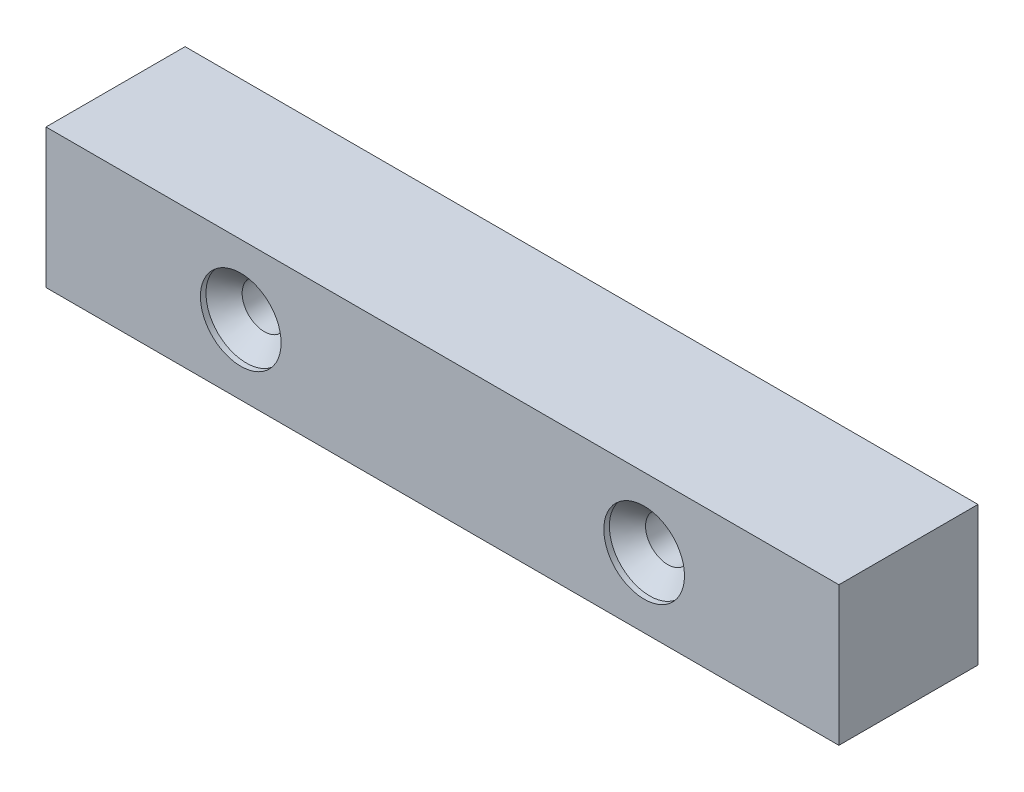
ISO-10303-21;
HEADER;
FILE_DESCRIPTION(('STEP AP214'),'2;1');
FILE_NAME('part.step','',(''),(''),'','','');
FILE_SCHEMA(('AUTOMOTIVE_DESIGN { 1 0 10303 214 1 1 1 1 }'));
ENDSEC;
DATA;
#1=APPLICATION_CONTEXT('core data for automotive mechanical design processes');
#2=APPLICATION_PROTOCOL_DEFINITION('international standard','automotive_design',2000,#1);
#3=PRODUCT_CONTEXT('',#1,'mechanical');
#4=PRODUCT('Part','Part','',(#3));
#5=PRODUCT_RELATED_PRODUCT_CATEGORY('part','',(#4));
#6=PRODUCT_DEFINITION_FORMATION('','',#4);
#7=PRODUCT_DEFINITION_CONTEXT('part definition',#1,'design');
#8=PRODUCT_DEFINITION('design','',#6,#7);
#9=PRODUCT_DEFINITION_SHAPE('','',#8);
#10=(LENGTH_UNIT() NAMED_UNIT(*) SI_UNIT(.MILLI.,.METRE.));
#11=(NAMED_UNIT(*) PLANE_ANGLE_UNIT() SI_UNIT($,.RADIAN.));
#12=(NAMED_UNIT(*) SI_UNIT($,.STERADIAN.) SOLID_ANGLE_UNIT());
#13=UNCERTAINTY_MEASURE_WITH_UNIT(LENGTH_MEASURE(1.E-05),#10,'distance_accuracy_value','');
#14=(GEOMETRIC_REPRESENTATION_CONTEXT(3) GLOBAL_UNCERTAINTY_ASSIGNED_CONTEXT((#13)) GLOBAL_UNIT_ASSIGNED_CONTEXT((#10,
#11,#12)) REPRESENTATION_CONTEXT('',''));
#15=CARTESIAN_POINT('',(0.,0.,0.));
#16=DIRECTION('',(0.,0.,1.));
#17=DIRECTION('',(1.,0.,0.));
#18=AXIS2_PLACEMENT_3D('',#15,#16,#17);
#19=CARTESIAN_POINT('',(-28.5,-17.2194934109435,10.));
#20=DIRECTION('',(1.,0.,0.));
#21=DIRECTION('',(0.,0.,-1.));
#22=AXIS2_PLACEMENT_3D('',#19,#20,#21);
#23=PLANE('',#22);
#24=DIRECTION('',(0.,-1.,0.));
#25=VECTOR('',#24,1.);
#26=CARTESIAN_POINT('',(-28.5,-17.2194934109435,0.));
#27=LINE('',#26,#25);
#28=CARTESIAN_POINT('',(-28.5,-17.2194934109435,0.));
#29=VERTEX_POINT('',#28);
#30=CARTESIAN_POINT('',(-28.5,-27.2194934109435,0.));
#31=VERTEX_POINT('',#30);
#32=EDGE_CURVE('E95',#29,#31,#27,.T.);
#33=ORIENTED_EDGE('',*,*,#32,.T.);
#34=DIRECTION('',(0.,0.,-1.));
#35=VECTOR('',#34,1.);
#36=CARTESIAN_POINT('',(-28.5,-27.2194934109435,10.));
#37=LINE('',#36,#35);
#38=CARTESIAN_POINT('',(-28.5,-27.2194934109435,10.));
#39=VERTEX_POINT('',#38);
#40=EDGE_CURVE('E11',#39,#31,#37,.T.);
#41=ORIENTED_EDGE('',*,*,#40,.F.);
#42=DIRECTION('',(0.,-1.,0.));
#43=VECTOR('',#42,1.);
#44=CARTESIAN_POINT('',(-28.5,-17.2194934109435,10.));
#45=LINE('',#44,#43);
#46=CARTESIAN_POINT('',(-28.5,-17.2194934109435,10.));
#47=VERTEX_POINT('',#46);
#48=EDGE_CURVE('E83',#47,#39,#45,.T.);
#49=ORIENTED_EDGE('',*,*,#48,.F.);
#50=DIRECTION('',(0.,0.,-1.));
#51=VECTOR('',#50,1.);
#52=CARTESIAN_POINT('',(-28.5,-17.2194934109435,10.));
#53=LINE('',#52,#51);
#54=EDGE_CURVE('E91',#47,#29,#53,.T.);
#55=ORIENTED_EDGE('',*,*,#54,.T.);
#56=EDGE_LOOP('',(#33,#41,#49,#55));
#57=FACE_BOUND('',#56,.T.);
#58=ADVANCED_FACE('F32',(#57),#23,.F.);
#59=CARTESIAN_POINT('',(-28.5,-27.2194934109435,10.));
#60=DIRECTION('',(0.,1.,0.));
#61=DIRECTION('',(0.,0.,1.));
#62=AXIS2_PLACEMENT_3D('',#59,#60,#61);
#63=PLANE('',#62);
#64=DIRECTION('',(1.,0.,0.));
#65=VECTOR('',#64,1.);
#66=CARTESIAN_POINT('',(-28.5,-27.2194934109435,0.));
#67=LINE('',#66,#65);
#68=CARTESIAN_POINT('',(28.5,-27.2194934109435,0.));
#69=VERTEX_POINT('',#68);
#70=EDGE_CURVE('E87',#31,#69,#67,.T.);
#71=ORIENTED_EDGE('',*,*,#70,.T.);
#72=DIRECTION('',(0.,0.,-1.));
#73=VECTOR('',#72,1.);
#74=CARTESIAN_POINT('',(28.5,-27.2194934109435,10.));
#75=LINE('',#74,#73);
#76=CARTESIAN_POINT('',(28.5,-27.2194934109435,10.));
#77=VERTEX_POINT('',#76);
#78=EDGE_CURVE('E40',#77,#69,#75,.T.);
#79=ORIENTED_EDGE('',*,*,#78,.F.);
#80=DIRECTION('',(1.,0.,0.));
#81=VECTOR('',#80,1.);
#82=CARTESIAN_POINT('',(-28.5,-27.2194934109435,10.));
#83=LINE('',#82,#81);
#84=EDGE_CURVE('E78',#39,#77,#83,.T.);
#85=ORIENTED_EDGE('',*,*,#84,.F.);
#86=ORIENTED_EDGE('',*,*,#40,.T.);
#87=EDGE_LOOP('',(#71,#79,#85,#86));
#88=FACE_BOUND('',#87,.T.);
#89=ADVANCED_FACE('F86',(#88),#63,.F.);
#90=CARTESIAN_POINT('',(28.5,-17.2194934109435,10.));
#91=DIRECTION('',(-1.,0.,0.));
#92=DIRECTION('',(0.,-1.,0.));
#93=AXIS2_PLACEMENT_3D('',#90,#91,#92);
#94=PLANE('',#93);
#95=DIRECTION('',(0.,1.,0.));
#96=VECTOR('',#95,1.);
#97=CARTESIAN_POINT('',(28.5,-17.2194934109435,0.));
#98=LINE('',#97,#96);
#99=CARTESIAN_POINT('',(28.5,-17.2194934109435,0.));
#100=VERTEX_POINT('',#99);
#101=EDGE_CURVE('E65',#69,#100,#98,.T.);
#102=ORIENTED_EDGE('',*,*,#101,.T.);
#103=DIRECTION('',(0.,0.,-1.));
#104=VECTOR('',#103,1.);
#105=CARTESIAN_POINT('',(28.5,-17.2194934109435,10.));
#106=LINE('',#105,#104);
#107=CARTESIAN_POINT('',(28.5,-17.2194934109435,10.));
#108=VERTEX_POINT('',#107);
#109=EDGE_CURVE('E88',#108,#100,#106,.T.);
#110=ORIENTED_EDGE('',*,*,#109,.F.);
#111=DIRECTION('',(0.,1.,0.));
#112=VECTOR('',#111,1.);
#113=CARTESIAN_POINT('',(28.5,-17.2194934109435,10.));
#114=LINE('',#113,#112);
#115=EDGE_CURVE('E81',#77,#108,#114,.T.);
#116=ORIENTED_EDGE('',*,*,#115,.F.);
#117=ORIENTED_EDGE('',*,*,#78,.T.);
#118=EDGE_LOOP('',(#102,#110,#116,#117));
#119=FACE_BOUND('',#118,.T.);
#120=ADVANCED_FACE('F89',(#119),#94,.F.);
#121=CARTESIAN_POINT('',(-28.5,-17.2194934109435,10.));
#122=DIRECTION('',(0.,-1.,0.));
#123=DIRECTION('',(0.,0.,-1.));
#124=AXIS2_PLACEMENT_3D('',#121,#122,#123);
#125=PLANE('',#124);
#126=DIRECTION('',(-1.,0.,0.));
#127=VECTOR('',#126,1.);
#128=CARTESIAN_POINT('',(-28.5,-17.2194934109435,0.));
#129=LINE('',#128,#127);
#130=EDGE_CURVE('E71',#100,#29,#129,.T.);
#131=ORIENTED_EDGE('',*,*,#130,.T.);
#132=ORIENTED_EDGE('',*,*,#54,.F.);
#133=DIRECTION('',(-1.,0.,0.));
#134=VECTOR('',#133,1.);
#135=CARTESIAN_POINT('',(-28.5,-17.2194934109435,10.));
#136=LINE('',#135,#134);
#137=EDGE_CURVE('E48',#108,#47,#136,.T.);
#138=ORIENTED_EDGE('',*,*,#137,.F.);
#139=ORIENTED_EDGE('',*,*,#109,.T.);
#140=EDGE_LOOP('',(#131,#132,#138,#139));
#141=FACE_BOUND('',#140,.T.);
#142=ADVANCED_FACE('F103',(#141),#125,.F.);
#143=CARTESIAN_POINT('',(0.,0.,10.));
#144=DIRECTION('',(0.,0.,1.));
#145=DIRECTION('',(1.,0.,0.));
#146=AXIS2_PLACEMENT_3D('',#143,#144,#145);
#147=PLANE('',#146);
#148=CARTESIAN_POINT('',(-14.4999999999999,-22.2194934109435,10.));
#149=DIRECTION('',(0.,0.,1.));
#150=DIRECTION('',(1.,0.,0.));
#151=AXIS2_PLACEMENT_3D('',#148,#149,#150);
#152=CIRCLE('',#151,2.9);
#153=CARTESIAN_POINT('',(-11.5999999999999,-22.2194934109435,10.));
#154=VERTEX_POINT('',#153);
#155=EDGE_CURVE('E129',#154,#154,#152,.T.);
#156=ORIENTED_EDGE('',*,*,#155,.F.);
#157=EDGE_LOOP('',(#156));
#158=FACE_BOUND('',#157,.T.);
#159=CARTESIAN_POINT('',(14.5000000000001,-22.2194934109435,10.));
#160=DIRECTION('',(0.,0.,1.));
#161=DIRECTION('',(1.,0.,0.));
#162=AXIS2_PLACEMENT_3D('',#159,#160,#161);
#163=CIRCLE('',#162,2.9);
#164=CARTESIAN_POINT('',(17.4000000000001,-22.2194934109435,10.));
#165=VERTEX_POINT('',#164);
#166=EDGE_CURVE('E117',#165,#165,#163,.T.);
#167=ORIENTED_EDGE('',*,*,#166,.F.);
#168=EDGE_LOOP('',(#167));
#169=FACE_BOUND('',#168,.T.);
#170=ORIENTED_EDGE('',*,*,#48,.T.);
#171=ORIENTED_EDGE('',*,*,#84,.T.);
#172=ORIENTED_EDGE('',*,*,#115,.T.);
#173=ORIENTED_EDGE('',*,*,#137,.T.);
#174=EDGE_LOOP('',(#170,#171,#172,#173));
#175=FACE_BOUND('',#174,.T.);
#176=ADVANCED_FACE('F79',(#158,#169,#175),#147,.T.);
#177=CARTESIAN_POINT('',(0.,0.,0.));
#178=DIRECTION('',(0.,0.,1.));
#179=DIRECTION('',(1.,0.,0.));
#180=AXIS2_PLACEMENT_3D('',#177,#178,#179);
#181=PLANE('',#180);
#182=CARTESIAN_POINT('',(-23.5000000000001,-22.2194934109435,0.));
#183=DIRECTION('',(0.,0.,1.));
#184=DIRECTION('',(1.,0.,0.));
#185=AXIS2_PLACEMENT_3D('',#182,#183,#184);
#186=CIRCLE('',#185,1.55);
#187=CARTESIAN_POINT('',(-21.9500000000001,-22.2194934109435,0.));
#188=VERTEX_POINT('',#187);
#189=EDGE_CURVE('E139',#188,#188,#186,.T.);
#190=ORIENTED_EDGE('',*,*,#189,.T.);
#191=EDGE_LOOP('',(#190));
#192=FACE_BOUND('',#191,.T.);
#193=CARTESIAN_POINT('',(23.5000000000001,-22.2194934109435,0.));
#194=DIRECTION('',(0.,0.,-1.));
#195=DIRECTION('',(-1.,0.,0.));
#196=AXIS2_PLACEMENT_3D('',#193,#194,#195);
#197=CIRCLE('',#196,1.55);
#198=CARTESIAN_POINT('',(21.9500000000001,-22.2194934109435,0.));
#199=VERTEX_POINT('',#198);
#200=EDGE_CURVE('E133',#199,#199,#197,.T.);
#201=ORIENTED_EDGE('',*,*,#200,.F.);
#202=EDGE_LOOP('',(#201));
#203=FACE_BOUND('',#202,.T.);
#204=CARTESIAN_POINT('',(-14.4999999999999,-22.2194934109435,0.));
#205=DIRECTION('',(0.,0.,1.));
#206=DIRECTION('',(1.,0.,0.));
#207=AXIS2_PLACEMENT_3D('',#204,#205,#206);
#208=CIRCLE('',#207,1.6);
#209=CARTESIAN_POINT('',(-12.8999999999999,-22.2194934109435,0.));
#210=VERTEX_POINT('',#209);
#211=EDGE_CURVE('E120',#210,#210,#208,.T.);
#212=ORIENTED_EDGE('',*,*,#211,.T.);
#213=EDGE_LOOP('',(#212));
#214=FACE_BOUND('',#213,.T.);
#215=CARTESIAN_POINT('',(14.5000000000001,-22.2194934109435,0.));
#216=DIRECTION('',(0.,0.,1.));
#217=DIRECTION('',(1.,0.,0.));
#218=AXIS2_PLACEMENT_3D('',#215,#216,#217);
#219=CIRCLE('',#218,1.6);
#220=CARTESIAN_POINT('',(16.1000000000001,-22.2194934109435,0.));
#221=VERTEX_POINT('',#220);
#222=EDGE_CURVE('E98',#221,#221,#219,.T.);
#223=ORIENTED_EDGE('',*,*,#222,.T.);
#224=EDGE_LOOP('',(#223));
#225=FACE_BOUND('',#224,.T.);
#226=ORIENTED_EDGE('',*,*,#32,.F.);
#227=ORIENTED_EDGE('',*,*,#130,.F.);
#228=ORIENTED_EDGE('',*,*,#101,.F.);
#229=ORIENTED_EDGE('',*,*,#70,.F.);
#230=EDGE_LOOP('',(#226,#227,#228,#229));
#231=FACE_BOUND('',#230,.T.);
#232=ADVANCED_FACE('F106',(#192,#203,#214,#225,#231),#181,.F.);
#233=CARTESIAN_POINT('',(14.5000000000001,-22.2194934109435,10.));
#234=DIRECTION('',(0.,0.,1.));
#235=DIRECTION('',(1.,0.,0.));
#236=AXIS2_PLACEMENT_3D('',#233,#234,#235);
#237=CYLINDRICAL_SURFACE('',#236,1.6);
#238=ORIENTED_EDGE('',*,*,#222,.F.);
#239=EDGE_LOOP('',(#238));
#240=FACE_BOUND('',#239,.T.);
#241=CARTESIAN_POINT('',(14.5000000000001,-22.2194934109435,8.3));
#242=DIRECTION('',(0.,0.,1.));
#243=DIRECTION('',(1.,0.,0.));
#244=AXIS2_PLACEMENT_3D('',#241,#242,#243);
#245=CIRCLE('',#244,1.6);
#246=CARTESIAN_POINT('',(16.1000000000001,-22.2194934109435,8.3));
#247=VERTEX_POINT('',#246);
#248=EDGE_CURVE('E111',#247,#247,#245,.T.);
#249=ORIENTED_EDGE('',*,*,#248,.T.);
#250=EDGE_LOOP('',(#249));
#251=FACE_BOUND('',#250,.T.);
#252=ADVANCED_FACE('F169',(#240,#251),#237,.F.);
#253=CARTESIAN_POINT('',(14.5000000000001,-22.2194934109435,9.6));
#254=DIRECTION('',(0.,0.,1.));
#255=DIRECTION('',(1.,0.,0.));
#256=AXIS2_PLACEMENT_3D('',#253,#254,#255);
#257=CONICAL_SURFACE('',#256,2.9,0.785398163397448);
#258=ORIENTED_EDGE('',*,*,#248,.F.);
#259=EDGE_LOOP('',(#258));
#260=FACE_BOUND('',#259,.T.);
#261=CARTESIAN_POINT('',(14.5000000000001,-22.2194934109435,9.6));
#262=DIRECTION('',(0.,0.,1.));
#263=DIRECTION('',(1.,0.,0.));
#264=AXIS2_PLACEMENT_3D('',#261,#262,#263);
#265=CIRCLE('',#264,2.9);
#266=CARTESIAN_POINT('',(17.4000000000001,-22.2194934109435,9.6));
#267=VERTEX_POINT('',#266);
#268=EDGE_CURVE('E114',#267,#267,#265,.T.);
#269=ORIENTED_EDGE('',*,*,#268,.T.);
#270=EDGE_LOOP('',(#269));
#271=FACE_BOUND('',#270,.T.);
#272=ADVANCED_FACE('F176',(#260,#271),#257,.F.);
#273=CARTESIAN_POINT('',(14.5000000000001,-22.2194934109435,10.));
#274=DIRECTION('',(0.,0.,1.));
#275=DIRECTION('',(1.,0.,0.));
#276=AXIS2_PLACEMENT_3D('',#273,#274,#275);
#277=CYLINDRICAL_SURFACE('',#276,2.9);
#278=ORIENTED_EDGE('',*,*,#268,.F.);
#279=EDGE_LOOP('',(#278));
#280=FACE_BOUND('',#279,.T.);
#281=ORIENTED_EDGE('',*,*,#166,.T.);
#282=EDGE_LOOP('',(#281));
#283=FACE_BOUND('',#282,.T.);
#284=ADVANCED_FACE('F180',(#280,#283),#277,.F.);
#285=CARTESIAN_POINT('',(-14.4999999999999,-22.2194934109435,10.));
#286=DIRECTION('',(0.,0.,1.));
#287=DIRECTION('',(1.,0.,0.));
#288=AXIS2_PLACEMENT_3D('',#285,#286,#287);
#289=CYLINDRICAL_SURFACE('',#288,1.6);
#290=ORIENTED_EDGE('',*,*,#211,.F.);
#291=EDGE_LOOP('',(#290));
#292=FACE_BOUND('',#291,.T.);
#293=CARTESIAN_POINT('',(-14.4999999999999,-22.2194934109435,8.3));
#294=DIRECTION('',(0.,0.,1.));
#295=DIRECTION('',(1.,0.,0.));
#296=AXIS2_PLACEMENT_3D('',#293,#294,#295);
#297=CIRCLE('',#296,1.6);
#298=CARTESIAN_POINT('',(-12.8999999999999,-22.2194934109435,8.3));
#299=VERTEX_POINT('',#298);
#300=EDGE_CURVE('E123',#299,#299,#297,.T.);
#301=ORIENTED_EDGE('',*,*,#300,.T.);
#302=EDGE_LOOP('',(#301));
#303=FACE_BOUND('',#302,.T.);
#304=ADVANCED_FACE('F184',(#292,#303),#289,.F.);
#305=CARTESIAN_POINT('',(-14.4999999999999,-22.2194934109435,9.6));
#306=DIRECTION('',(0.,0.,1.));
#307=DIRECTION('',(1.,0.,0.));
#308=AXIS2_PLACEMENT_3D('',#305,#306,#307);
#309=CONICAL_SURFACE('',#308,2.9,0.785398163397448);
#310=ORIENTED_EDGE('',*,*,#300,.F.);
#311=EDGE_LOOP('',(#310));
#312=FACE_BOUND('',#311,.T.);
#313=CARTESIAN_POINT('',(-14.4999999999999,-22.2194934109435,9.6));
#314=DIRECTION('',(0.,0.,1.));
#315=DIRECTION('',(1.,0.,0.));
#316=AXIS2_PLACEMENT_3D('',#313,#314,#315);
#317=CIRCLE('',#316,2.9);
#318=CARTESIAN_POINT('',(-11.5999999999999,-22.2194934109435,9.6));
#319=VERTEX_POINT('',#318);
#320=EDGE_CURVE('E126',#319,#319,#317,.T.);
#321=ORIENTED_EDGE('',*,*,#320,.T.);
#322=EDGE_LOOP('',(#321));
#323=FACE_BOUND('',#322,.T.);
#324=ADVANCED_FACE('F188',(#312,#323),#309,.F.);
#325=CARTESIAN_POINT('',(-14.4999999999999,-22.2194934109435,10.));
#326=DIRECTION('',(0.,0.,1.));
#327=DIRECTION('',(1.,0.,0.));
#328=AXIS2_PLACEMENT_3D('',#325,#326,#327);
#329=CYLINDRICAL_SURFACE('',#328,2.9);
#330=ORIENTED_EDGE('',*,*,#320,.F.);
#331=EDGE_LOOP('',(#330));
#332=FACE_BOUND('',#331,.T.);
#333=ORIENTED_EDGE('',*,*,#155,.T.);
#334=EDGE_LOOP('',(#333));
#335=FACE_BOUND('',#334,.T.);
#336=ADVANCED_FACE('F192',(#332,#335),#329,.F.);
#337=CARTESIAN_POINT('',(23.5000000000001,-22.2194934109435,5.));
#338=DIRECTION('',(0.,0.,-1.));
#339=DIRECTION('',(-1.,0.,0.));
#340=AXIS2_PLACEMENT_3D('',#337,#338,#339);
#341=CYLINDRICAL_SURFACE('',#340,1.55);
#342=CARTESIAN_POINT('',(23.5000000000001,-22.2194934109435,5.));
#343=DIRECTION('',(0.,0.,-1.));
#344=DIRECTION('',(-1.,0.,0.));
#345=AXIS2_PLACEMENT_3D('',#342,#343,#344);
#346=CIRCLE('',#345,1.55);
#347=CARTESIAN_POINT('',(21.9500000000001,-22.2194934109435,5.));
#348=VERTEX_POINT('',#347);
#349=EDGE_CURVE('E132',#348,#348,#346,.T.);
#350=ORIENTED_EDGE('',*,*,#349,.F.);
#351=EDGE_LOOP('',(#350));
#352=FACE_BOUND('',#351,.T.);
#353=ORIENTED_EDGE('',*,*,#200,.T.);
#354=EDGE_LOOP('',(#353));
#355=FACE_BOUND('',#354,.T.);
#356=ADVANCED_FACE('F196',(#352,#355),#341,.F.);
#357=CARTESIAN_POINT('',(23.5000000000001,-22.2194934109435,5.));
#358=DIRECTION('',(0.,0.,-1.));
#359=DIRECTION('',(-1.,0.,0.));
#360=AXIS2_PLACEMENT_3D('',#357,#358,#359);
#361=PLANE('',#360);
#362=ORIENTED_EDGE('',*,*,#349,.T.);
#363=EDGE_LOOP('',(#362));
#364=FACE_BOUND('',#363,.T.);
#365=ADVANCED_FACE('F154',(#364),#361,.T.);
#366=CARTESIAN_POINT('',(-23.5000000000001,-22.2194934109435,5.));
#367=DIRECTION('',(0.,0.,-1.));
#368=DIRECTION('',(-1.,0.,0.));
#369=AXIS2_PLACEMENT_3D('',#366,#367,#368);
#370=CYLINDRICAL_SURFACE('',#369,1.55);
#371=CARTESIAN_POINT('',(-23.5000000000001,-22.2194934109435,5.));
#372=DIRECTION('',(0.,0.,1.));
#373=DIRECTION('',(1.,0.,0.));
#374=AXIS2_PLACEMENT_3D('',#371,#372,#373);
#375=CIRCLE('',#374,1.55);
#376=CARTESIAN_POINT('',(-21.9500000000001,-22.2194934109435,5.));
#377=VERTEX_POINT('',#376);
#378=EDGE_CURVE('E136',#377,#377,#375,.T.);
#379=ORIENTED_EDGE('',*,*,#378,.T.);
#380=EDGE_LOOP('',(#379));
#381=FACE_BOUND('',#380,.T.);
#382=ORIENTED_EDGE('',*,*,#189,.F.);
#383=EDGE_LOOP('',(#382));
#384=FACE_BOUND('',#383,.T.);
#385=ADVANCED_FACE('F145',(#381,#384),#370,.F.);
#386=CARTESIAN_POINT('',(-23.5000000000001,-22.2194934109435,5.));
#387=DIRECTION('',(0.,0.,-1.));
#388=DIRECTION('',(1.,0.,0.));
#389=AXIS2_PLACEMENT_3D('',#386,#387,#388);
#390=PLANE('',#389);
#391=ORIENTED_EDGE('',*,*,#378,.F.);
#392=EDGE_LOOP('',(#391));
#393=FACE_BOUND('',#392,.T.);
#394=ADVANCED_FACE('F148',(#393),#390,.T.);
#395=CLOSED_SHELL('',(#58,#89,#120,#142,#176,#232,#252,#272,#284,#304,#324,#336,#356,#365,#385,#394));
#396=MANIFOLD_SOLID_BREP('B2',#395);
#397=ADVANCED_BREP_SHAPE_REPRESENTATION('',(#18,#396),#14);
#398=SHAPE_DEFINITION_REPRESENTATION(#9,#397);
ENDSEC;
END-ISO-10303-21;
